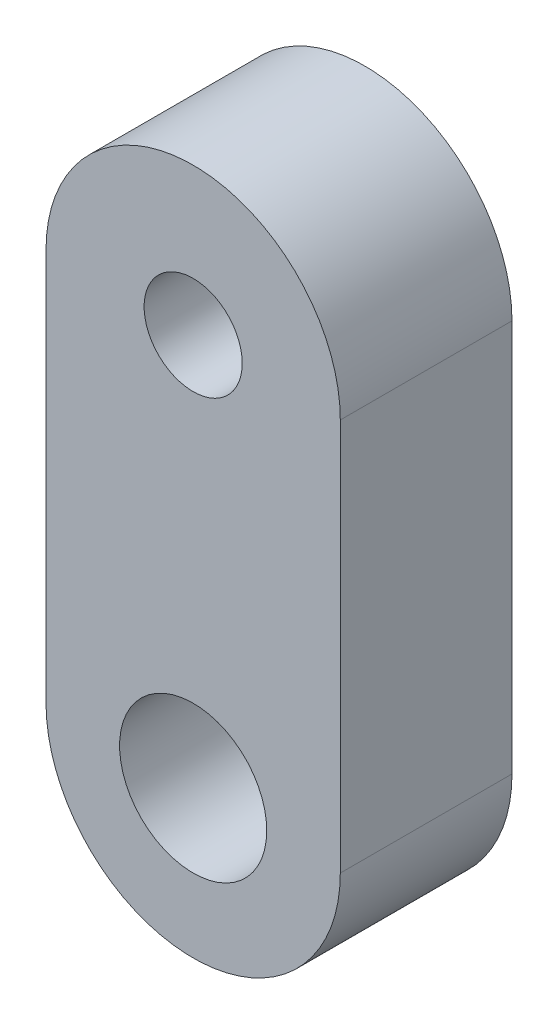
ISO-10303-21;
HEADER;
FILE_DESCRIPTION(('STEP AP214'),'2;1');
FILE_NAME('part.step','',(''),(''),'','','');
FILE_SCHEMA(('AUTOMOTIVE_DESIGN { 1 0 10303 214 1 1 1 1 }'));
ENDSEC;
DATA;
#1=APPLICATION_CONTEXT('core data for automotive mechanical design processes');
#2=APPLICATION_PROTOCOL_DEFINITION('international standard','automotive_design',2000,#1);
#3=PRODUCT_CONTEXT('',#1,'mechanical');
#4=PRODUCT('Part','Part','',(#3));
#5=PRODUCT_RELATED_PRODUCT_CATEGORY('part','',(#4));
#6=PRODUCT_DEFINITION_FORMATION('','',#4);
#7=PRODUCT_DEFINITION_CONTEXT('part definition',#1,'design');
#8=PRODUCT_DEFINITION('design','',#6,#7);
#9=PRODUCT_DEFINITION_SHAPE('','',#8);
#10=(LENGTH_UNIT() NAMED_UNIT(*) SI_UNIT(.MILLI.,.METRE.));
#11=(NAMED_UNIT(*) PLANE_ANGLE_UNIT() SI_UNIT($,.RADIAN.));
#12=(NAMED_UNIT(*) SI_UNIT($,.STERADIAN.) SOLID_ANGLE_UNIT());
#13=UNCERTAINTY_MEASURE_WITH_UNIT(LENGTH_MEASURE(1.E-05),#10,'distance_accuracy_value','');
#14=(GEOMETRIC_REPRESENTATION_CONTEXT(3) GLOBAL_UNCERTAINTY_ASSIGNED_CONTEXT((#13)) GLOBAL_UNIT_ASSIGNED_CONTEXT((#10,
#11,#12)) REPRESENTATION_CONTEXT('',''));
#15=CARTESIAN_POINT('',(0.,0.,0.));
#16=DIRECTION('',(0.,0.,1.));
#17=DIRECTION('',(1.,0.,0.));
#18=AXIS2_PLACEMENT_3D('',#15,#16,#17);
#19=CARTESIAN_POINT('',(0.,0.,3.5));
#20=DIRECTION('',(0.,0.,1.));
#21=DIRECTION('',(1.,0.,0.));
#22=AXIS2_PLACEMENT_3D('',#19,#20,#21);
#23=PLANE('',#22);
#24=CARTESIAN_POINT('',(0.,0.,3.5));
#25=DIRECTION('',(0.,0.,1.));
#26=DIRECTION('',(1.,0.,0.));
#27=AXIS2_PLACEMENT_3D('',#24,#25,#26);
#28=CIRCLE('',#27,1.5);
#29=CARTESIAN_POINT('',(1.5,0.,3.5));
#30=VERTEX_POINT('',#29);
#31=EDGE_CURVE('E104',#30,#30,#28,.T.);
#32=ORIENTED_EDGE('',*,*,#31,.F.);
#33=EDGE_LOOP('',(#32));
#34=FACE_BOUND('',#33,.T.);
#35=CARTESIAN_POINT('',(0.,0.,3.5));
#36=DIRECTION('',(0.,0.,1.));
#37=DIRECTION('',(1.,0.,0.));
#38=AXIS2_PLACEMENT_3D('',#35,#36,#37);
#39=CIRCLE('',#38,3.);
#40=CARTESIAN_POINT('',(-3.,0.,3.5));
#41=VERTEX_POINT('',#40);
#42=CARTESIAN_POINT('',(3.,0.,3.5));
#43=VERTEX_POINT('',#42);
#44=EDGE_CURVE('E89',#41,#43,#39,.T.);
#45=ORIENTED_EDGE('',*,*,#44,.T.);
#46=DIRECTION('',(0.,1.,0.));
#47=VECTOR('',#46,1.);
#48=CARTESIAN_POINT('',(3.,0.,3.5));
#49=LINE('',#48,#47);
#50=CARTESIAN_POINT('',(3.,8.,3.5));
#51=VERTEX_POINT('',#50);
#52=EDGE_CURVE('E84',#43,#51,#49,.T.);
#53=ORIENTED_EDGE('',*,*,#52,.T.);
#54=CARTESIAN_POINT('',(0.,8.,3.5));
#55=DIRECTION('',(0.,0.,1.));
#56=DIRECTION('',(1.,0.,0.));
#57=AXIS2_PLACEMENT_3D('',#54,#55,#56);
#58=CIRCLE('',#57,3.);
#59=CARTESIAN_POINT('',(-3.,8.,3.5));
#60=VERTEX_POINT('',#59);
#61=EDGE_CURVE('E87',#51,#60,#58,.T.);
#62=ORIENTED_EDGE('',*,*,#61,.T.);
#63=DIRECTION('',(0.,-1.,0.));
#64=VECTOR('',#63,1.);
#65=CARTESIAN_POINT('',(-3.,0.,3.5));
#66=LINE('',#65,#64);
#67=EDGE_CURVE('E54',#60,#41,#66,.T.);
#68=ORIENTED_EDGE('',*,*,#67,.T.);
#69=EDGE_LOOP('',(#45,#53,#62,#68));
#70=FACE_BOUND('',#69,.T.);
#71=CARTESIAN_POINT('',(0.,8.,3.5));
#72=DIRECTION('',(0.,0.,1.));
#73=DIRECTION('',(1.,0.,0.));
#74=AXIS2_PLACEMENT_3D('',#71,#72,#73);
#75=CIRCLE('',#74,1.);
#76=CARTESIAN_POINT('',(0.999999999999999,8.,3.5));
#77=VERTEX_POINT('',#76);
#78=EDGE_CURVE('E119',#77,#77,#75,.T.);
#79=ORIENTED_EDGE('',*,*,#78,.F.);
#80=EDGE_LOOP('',(#79));
#81=FACE_BOUND('',#80,.T.);
#82=ADVANCED_FACE('F37',(#34,#70,#81),#23,.T.);
#83=CARTESIAN_POINT('',(0.,0.,0.));
#84=DIRECTION('',(0.,0.,1.));
#85=DIRECTION('',(1.,0.,0.));
#86=AXIS2_PLACEMENT_3D('',#83,#84,#85);
#87=PLANE('',#86);
#88=CARTESIAN_POINT('',(0.,0.,0.));
#89=DIRECTION('',(0.,0.,1.));
#90=DIRECTION('',(1.,0.,0.));
#91=AXIS2_PLACEMENT_3D('',#88,#89,#90);
#92=CIRCLE('',#91,3.);
#93=CARTESIAN_POINT('',(-3.,0.,0.));
#94=VERTEX_POINT('',#93);
#95=CARTESIAN_POINT('',(3.,0.,0.));
#96=VERTEX_POINT('',#95);
#97=EDGE_CURVE('E101',#94,#96,#92,.T.);
#98=ORIENTED_EDGE('',*,*,#97,.F.);
#99=DIRECTION('',(0.,-1.,0.));
#100=VECTOR('',#99,1.);
#101=CARTESIAN_POINT('',(-3.,0.,0.));
#102=LINE('',#101,#100);
#103=CARTESIAN_POINT('',(-3.,8.,0.));
#104=VERTEX_POINT('',#103);
#105=EDGE_CURVE('E77',#104,#94,#102,.T.);
#106=ORIENTED_EDGE('',*,*,#105,.F.);
#107=CARTESIAN_POINT('',(0.,8.,0.));
#108=DIRECTION('',(0.,0.,1.));
#109=DIRECTION('',(1.,0.,0.));
#110=AXIS2_PLACEMENT_3D('',#107,#108,#109);
#111=CIRCLE('',#110,3.);
#112=CARTESIAN_POINT('',(3.,8.,0.));
#113=VERTEX_POINT('',#112);
#114=EDGE_CURVE('E71',#113,#104,#111,.T.);
#115=ORIENTED_EDGE('',*,*,#114,.F.);
#116=DIRECTION('',(0.,1.,0.));
#117=VECTOR('',#116,1.);
#118=CARTESIAN_POINT('',(3.,0.,0.));
#119=LINE('',#118,#117);
#120=EDGE_CURVE('E93',#96,#113,#119,.T.);
#121=ORIENTED_EDGE('',*,*,#120,.F.);
#122=EDGE_LOOP('',(#98,#106,#115,#121));
#123=FACE_BOUND('',#122,.T.);
#124=CARTESIAN_POINT('',(0.,0.,0.));
#125=DIRECTION('',(0.,0.,1.));
#126=DIRECTION('',(1.,0.,0.));
#127=AXIS2_PLACEMENT_3D('',#124,#125,#126);
#128=CIRCLE('',#127,1.5);
#129=CARTESIAN_POINT('',(1.5,0.,0.));
#130=VERTEX_POINT('',#129);
#131=EDGE_CURVE('E116',#130,#130,#128,.T.);
#132=ORIENTED_EDGE('',*,*,#131,.T.);
#133=EDGE_LOOP('',(#132));
#134=FACE_BOUND('',#133,.T.);
#135=CARTESIAN_POINT('',(0.,8.,0.));
#136=DIRECTION('',(0.,0.,1.));
#137=DIRECTION('',(1.,0.,0.));
#138=AXIS2_PLACEMENT_3D('',#135,#136,#137);
#139=CIRCLE('',#138,1.);
#140=CARTESIAN_POINT('',(0.999999999999999,8.,0.));
#141=VERTEX_POINT('',#140);
#142=EDGE_CURVE('E122',#141,#141,#139,.T.);
#143=ORIENTED_EDGE('',*,*,#142,.T.);
#144=EDGE_LOOP('',(#143));
#145=FACE_BOUND('',#144,.T.);
#146=ADVANCED_FACE('F112',(#123,#134,#145),#87,.F.);
#147=CARTESIAN_POINT('',(0.,0.,3.5));
#148=DIRECTION('',(0.,0.,-1.));
#149=DIRECTION('',(-1.,0.,0.));
#150=AXIS2_PLACEMENT_3D('',#147,#148,#149);
#151=CYLINDRICAL_SURFACE('',#150,3.);
#152=ORIENTED_EDGE('',*,*,#97,.T.);
#153=DIRECTION('',(0.,0.,-1.));
#154=VECTOR('',#153,1.);
#155=CARTESIAN_POINT('',(3.,0.,3.5));
#156=LINE('',#155,#154);
#157=EDGE_CURVE('E11',#43,#96,#156,.T.);
#158=ORIENTED_EDGE('',*,*,#157,.F.);
#159=ORIENTED_EDGE('',*,*,#44,.F.);
#160=DIRECTION('',(0.,0.,-1.));
#161=VECTOR('',#160,1.);
#162=CARTESIAN_POINT('',(-3.,0.,3.5));
#163=LINE('',#162,#161);
#164=EDGE_CURVE('E97',#41,#94,#163,.T.);
#165=ORIENTED_EDGE('',*,*,#164,.T.);
#166=EDGE_LOOP('',(#152,#158,#159,#165));
#167=FACE_BOUND('',#166,.T.);
#168=ADVANCED_FACE('F39',(#167),#151,.T.);
#169=CARTESIAN_POINT('',(3.,0.,3.5));
#170=DIRECTION('',(-1.,0.,0.));
#171=DIRECTION('',(0.,0.,1.));
#172=AXIS2_PLACEMENT_3D('',#169,#170,#171);
#173=PLANE('',#172);
#174=ORIENTED_EDGE('',*,*,#120,.T.);
#175=DIRECTION('',(0.,0.,-1.));
#176=VECTOR('',#175,1.);
#177=CARTESIAN_POINT('',(3.,8.,3.5));
#178=LINE('',#177,#176);
#179=EDGE_CURVE('E46',#51,#113,#178,.T.);
#180=ORIENTED_EDGE('',*,*,#179,.F.);
#181=ORIENTED_EDGE('',*,*,#52,.F.);
#182=ORIENTED_EDGE('',*,*,#157,.T.);
#183=EDGE_LOOP('',(#174,#180,#181,#182));
#184=FACE_BOUND('',#183,.T.);
#185=ADVANCED_FACE('F92',(#184),#173,.F.);
#186=CARTESIAN_POINT('',(0.,8.,3.5));
#187=DIRECTION('',(0.,0.,-1.));
#188=DIRECTION('',(-1.,0.,0.));
#189=AXIS2_PLACEMENT_3D('',#186,#187,#188);
#190=CYLINDRICAL_SURFACE('',#189,3.);
#191=ORIENTED_EDGE('',*,*,#114,.T.);
#192=DIRECTION('',(0.,0.,-1.));
#193=VECTOR('',#192,1.);
#194=CARTESIAN_POINT('',(-3.,8.,3.5));
#195=LINE('',#194,#193);
#196=EDGE_CURVE('E94',#60,#104,#195,.T.);
#197=ORIENTED_EDGE('',*,*,#196,.F.);
#198=ORIENTED_EDGE('',*,*,#61,.F.);
#199=ORIENTED_EDGE('',*,*,#179,.T.);
#200=EDGE_LOOP('',(#191,#197,#198,#199));
#201=FACE_BOUND('',#200,.T.);
#202=ADVANCED_FACE('F95',(#201),#190,.T.);
#203=CARTESIAN_POINT('',(-3.,0.,3.5));
#204=DIRECTION('',(1.,0.,0.));
#205=DIRECTION('',(0.,0.,-1.));
#206=AXIS2_PLACEMENT_3D('',#203,#204,#205);
#207=PLANE('',#206);
#208=ORIENTED_EDGE('',*,*,#105,.T.);
#209=ORIENTED_EDGE('',*,*,#164,.F.);
#210=ORIENTED_EDGE('',*,*,#67,.F.);
#211=ORIENTED_EDGE('',*,*,#196,.T.);
#212=EDGE_LOOP('',(#208,#209,#210,#211));
#213=FACE_BOUND('',#212,.T.);
#214=ADVANCED_FACE('F109',(#213),#207,.F.);
#215=CARTESIAN_POINT('',(0.,0.,3.5));
#216=DIRECTION('',(0.,0.,-1.));
#217=DIRECTION('',(-1.,0.,0.));
#218=AXIS2_PLACEMENT_3D('',#215,#216,#217);
#219=CYLINDRICAL_SURFACE('',#218,1.5);
#220=ORIENTED_EDGE('',*,*,#31,.T.);
#221=EDGE_LOOP('',(#220));
#222=FACE_BOUND('',#221,.T.);
#223=ORIENTED_EDGE('',*,*,#131,.F.);
#224=EDGE_LOOP('',(#223));
#225=FACE_BOUND('',#224,.T.);
#226=ADVANCED_FACE('F139',(#222,#225),#219,.F.);
#227=CARTESIAN_POINT('',(0.,8.,3.5));
#228=DIRECTION('',(0.,0.,-1.));
#229=DIRECTION('',(-1.,0.,0.));
#230=AXIS2_PLACEMENT_3D('',#227,#228,#229);
#231=CYLINDRICAL_SURFACE('',#230,1.);
#232=ORIENTED_EDGE('',*,*,#78,.T.);
#233=EDGE_LOOP('',(#232));
#234=FACE_BOUND('',#233,.T.);
#235=ORIENTED_EDGE('',*,*,#142,.F.);
#236=EDGE_LOOP('',(#235));
#237=FACE_BOUND('',#236,.T.);
#238=ADVANCED_FACE('F128',(#234,#237),#231,.F.);
#239=CLOSED_SHELL('',(#82,#146,#168,#185,#202,#214,#226,#238));
#240=MANIFOLD_SOLID_BREP('B2',#239);
#241=ADVANCED_BREP_SHAPE_REPRESENTATION('',(#18,#240),#14);
#242=SHAPE_DEFINITION_REPRESENTATION(#9,#241);
ENDSEC;
END-ISO-10303-21;
